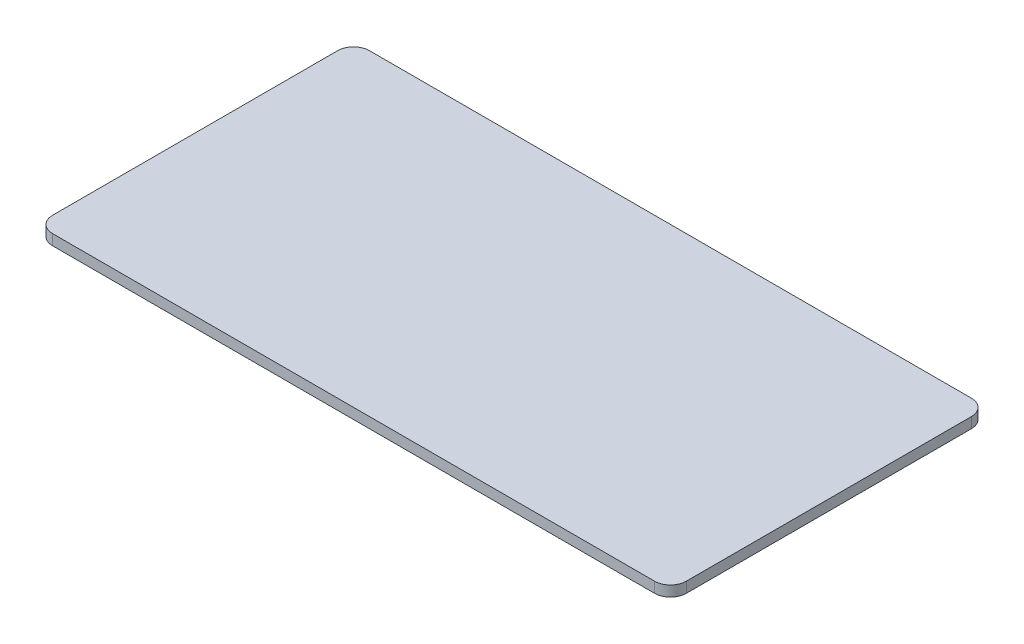
ISO-10303-21;
HEADER;
FILE_DESCRIPTION(('STEP AP214'),'2;1');
FILE_NAME('part.step','',(''),(''),'','','');
FILE_SCHEMA(('AUTOMOTIVE_DESIGN { 1 0 10303 214 1 1 1 1 }'));
ENDSEC;
DATA;
#1=APPLICATION_CONTEXT('core data for automotive mechanical design processes');
#2=APPLICATION_PROTOCOL_DEFINITION('international standard','automotive_design',2000,#1);
#3=PRODUCT_CONTEXT('',#1,'mechanical');
#4=PRODUCT('Part','Part','',(#3));
#5=PRODUCT_RELATED_PRODUCT_CATEGORY('part','',(#4));
#6=PRODUCT_DEFINITION_FORMATION('','',#4);
#7=PRODUCT_DEFINITION_CONTEXT('part definition',#1,'design');
#8=PRODUCT_DEFINITION('design','',#6,#7);
#9=PRODUCT_DEFINITION_SHAPE('','',#8);
#10=(LENGTH_UNIT() NAMED_UNIT(*) SI_UNIT(.MILLI.,.METRE.));
#11=(NAMED_UNIT(*) PLANE_ANGLE_UNIT() SI_UNIT($,.RADIAN.));
#12=(NAMED_UNIT(*) SI_UNIT($,.STERADIAN.) SOLID_ANGLE_UNIT());
#13=UNCERTAINTY_MEASURE_WITH_UNIT(LENGTH_MEASURE(1.E-05),#10,'distance_accuracy_value','');
#14=(GEOMETRIC_REPRESENTATION_CONTEXT(3) GLOBAL_UNCERTAINTY_ASSIGNED_CONTEXT((#13)) GLOBAL_UNIT_ASSIGNED_CONTEXT((#10,
#11,#12)) REPRESENTATION_CONTEXT('',''));
#15=CARTESIAN_POINT('',(0.,0.,0.));
#16=DIRECTION('',(0.,0.,1.));
#17=DIRECTION('',(1.,0.,0.));
#18=AXIS2_PLACEMENT_3D('',#15,#16,#17);
#19=CARTESIAN_POINT('',(-513.972080869749,20.,307.319748063678));
#20=DIRECTION('',(1.,0.,0.));
#21=DIRECTION('',(0.,0.,-1.));
#22=AXIS2_PLACEMENT_3D('',#19,#20,#21);
#23=PLANE('',#22);
#24=DIRECTION('',(0.,0.,1.));
#25=VECTOR('',#24,1.);
#26=CARTESIAN_POINT('',(-513.972080869749,20.,307.319748063678));
#27=LINE('',#26,#25);
#28=CARTESIAN_POINT('',(-513.972080869749,20.,-262.680251936322));
#29=VERTEX_POINT('',#28);
#30=CARTESIAN_POINT('',(-513.972080869749,20.,277.319748063678));
#31=VERTEX_POINT('',#30);
#32=EDGE_CURVE('E117',#29,#31,#27,.T.);
#33=ORIENTED_EDGE('',*,*,#32,.F.);
#34=DIRECTION('',(0.,-1.,0.));
#35=VECTOR('',#34,1.);
#36=CARTESIAN_POINT('',(-513.972080869749,20.,-262.680251936322));
#37=LINE('',#36,#35);
#38=CARTESIAN_POINT('',(-513.972080869749,0.,-262.680251936322));
#39=VERTEX_POINT('',#38);
#40=EDGE_CURVE('E102',#29,#39,#37,.T.);
#41=ORIENTED_EDGE('',*,*,#40,.T.);
#42=DIRECTION('',(0.,0.,1.));
#43=VECTOR('',#42,1.);
#44=CARTESIAN_POINT('',(-513.972080869749,0.,307.319748063678));
#45=LINE('',#44,#43);
#46=CARTESIAN_POINT('',(-513.972080869749,0.,277.319748063678));
#47=VERTEX_POINT('',#46);
#48=EDGE_CURVE('E114',#39,#47,#45,.T.);
#49=ORIENTED_EDGE('',*,*,#48,.T.);
#50=DIRECTION('',(0.,-1.,0.));
#51=VECTOR('',#50,1.);
#52=CARTESIAN_POINT('',(-513.972080869749,20.,277.319748063678));
#53=LINE('',#52,#51);
#54=EDGE_CURVE('E119',#47,#31,#53,.F.);
#55=ORIENTED_EDGE('',*,*,#54,.T.);
#56=EDGE_LOOP('',(#33,#41,#49,#55));
#57=FACE_BOUND('',#56,.T.);
#58=ADVANCED_FACE('F33',(#57),#23,.F.);
#59=CARTESIAN_POINT('',(-513.972080869749,20.,307.319748063678));
#60=DIRECTION('',(0.,0.,-1.));
#61=DIRECTION('',(-1.,0.,0.));
#62=AXIS2_PLACEMENT_3D('',#59,#60,#61);
#63=PLANE('',#62);
#64=DIRECTION('',(1.,0.,0.));
#65=VECTOR('',#64,1.);
#66=CARTESIAN_POINT('',(-513.972080869749,20.,307.319748063678));
#67=LINE('',#66,#65);
#68=CARTESIAN_POINT('',(-483.972080869749,20.,307.319748063678));
#69=VERTEX_POINT('',#68);
#70=CARTESIAN_POINT('',(656.027919130251,20.,307.319748063678));
#71=VERTEX_POINT('',#70);
#72=EDGE_CURVE('E168',#69,#71,#67,.T.);
#73=ORIENTED_EDGE('',*,*,#72,.F.);
#74=DIRECTION('',(0.,-1.,0.));
#75=VECTOR('',#74,1.);
#76=CARTESIAN_POINT('',(-483.972080869749,20.,307.319748063678));
#77=LINE('',#76,#75);
#78=CARTESIAN_POINT('',(-483.972080869749,0.,307.319748063678));
#79=VERTEX_POINT('',#78);
#80=EDGE_CURVE('E152',#69,#79,#77,.T.);
#81=ORIENTED_EDGE('',*,*,#80,.T.);
#82=DIRECTION('',(1.,0.,0.));
#83=VECTOR('',#82,1.);
#84=CARTESIAN_POINT('',(-513.972080869749,0.,307.319748063678));
#85=LINE('',#84,#83);
#86=CARTESIAN_POINT('',(656.027919130251,0.,307.319748063678));
#87=VERTEX_POINT('',#86);
#88=EDGE_CURVE('E123',#79,#87,#85,.T.);
#89=ORIENTED_EDGE('',*,*,#88,.T.);
#90=DIRECTION('',(0.,-1.,0.));
#91=VECTOR('',#90,1.);
#92=CARTESIAN_POINT('',(656.027919130251,20.,307.319748063678));
#93=LINE('',#92,#91);
#94=EDGE_CURVE('E150',#87,#71,#93,.F.);
#95=ORIENTED_EDGE('',*,*,#94,.T.);
#96=EDGE_LOOP('',(#73,#81,#89,#95));
#97=FACE_BOUND('',#96,.T.);
#98=ADVANCED_FACE('F178',(#97),#63,.F.);
#99=CARTESIAN_POINT('',(686.027919130251,20.,307.319748063678));
#100=DIRECTION('',(-1.,0.,0.));
#101=DIRECTION('',(0.,0.,1.));
#102=AXIS2_PLACEMENT_3D('',#99,#100,#101);
#103=PLANE('',#102);
#104=DIRECTION('',(0.,0.,-1.));
#105=VECTOR('',#104,1.);
#106=CARTESIAN_POINT('',(686.027919130251,0.,307.319748063678));
#107=LINE('',#106,#105);
#108=CARTESIAN_POINT('',(686.027919130251,0.,277.319748063678));
#109=VERTEX_POINT('',#108);
#110=CARTESIAN_POINT('',(686.027919130251,0.,-262.680251936322));
#111=VERTEX_POINT('',#110);
#112=EDGE_CURVE('E126',#109,#111,#107,.T.);
#113=ORIENTED_EDGE('',*,*,#112,.T.);
#114=DIRECTION('',(0.,-1.,0.));
#115=VECTOR('',#114,1.);
#116=CARTESIAN_POINT('',(686.027919130251,20.,-262.680251936322));
#117=LINE('',#116,#115);
#118=CARTESIAN_POINT('',(686.027919130251,20.,-262.680251936322));
#119=VERTEX_POINT('',#118);
#120=EDGE_CURVE('E11',#111,#119,#117,.F.);
#121=ORIENTED_EDGE('',*,*,#120,.T.);
#122=DIRECTION('',(0.,0.,-1.));
#123=VECTOR('',#122,1.);
#124=CARTESIAN_POINT('',(686.027919130251,20.,307.319748063678));
#125=LINE('',#124,#123);
#126=CARTESIAN_POINT('',(686.027919130251,20.,277.319748063678));
#127=VERTEX_POINT('',#126);
#128=EDGE_CURVE('E158',#127,#119,#125,.T.);
#129=ORIENTED_EDGE('',*,*,#128,.F.);
#130=DIRECTION('',(0.,-1.,0.));
#131=VECTOR('',#130,1.);
#132=CARTESIAN_POINT('',(686.027919130251,20.,277.319748063678));
#133=LINE('',#132,#131);
#134=EDGE_CURVE('E41',#127,#109,#133,.T.);
#135=ORIENTED_EDGE('',*,*,#134,.T.);
#136=EDGE_LOOP('',(#113,#121,#129,#135));
#137=FACE_BOUND('',#136,.T.);
#138=ADVANCED_FACE('F157',(#137),#103,.F.);
#139=CARTESIAN_POINT('',(-513.972080869749,20.,-292.680251936322));
#140=DIRECTION('',(0.,0.,1.));
#141=DIRECTION('',(1.,0.,0.));
#142=AXIS2_PLACEMENT_3D('',#139,#140,#141);
#143=PLANE('',#142);
#144=DIRECTION('',(-1.,0.,0.));
#145=VECTOR('',#144,1.);
#146=CARTESIAN_POINT('',(-513.972080869749,0.,-292.680251936322));
#147=LINE('',#146,#145);
#148=CARTESIAN_POINT('',(656.027919130251,0.,-292.680251936322));
#149=VERTEX_POINT('',#148);
#150=CARTESIAN_POINT('',(-483.972080869749,0.,-292.680251936322));
#151=VERTEX_POINT('',#150);
#152=EDGE_CURVE('E133',#149,#151,#147,.T.);
#153=ORIENTED_EDGE('',*,*,#152,.T.);
#154=DIRECTION('',(0.,-1.,0.));
#155=VECTOR('',#154,1.);
#156=CARTESIAN_POINT('',(-483.972080869749,20.,-292.680251936322));
#157=LINE('',#156,#155);
#158=CARTESIAN_POINT('',(-483.972080869749,20.,-292.680251936322));
#159=VERTEX_POINT('',#158);
#160=EDGE_CURVE('E103',#151,#159,#157,.F.);
#161=ORIENTED_EDGE('',*,*,#160,.T.);
#162=DIRECTION('',(-1.,0.,0.));
#163=VECTOR('',#162,1.);
#164=CARTESIAN_POINT('',(-513.972080869749,20.,-292.680251936322));
#165=LINE('',#164,#163);
#166=CARTESIAN_POINT('',(656.027919130251,20.,-292.680251936322));
#167=VERTEX_POINT('',#166);
#168=EDGE_CURVE('E129',#167,#159,#165,.T.);
#169=ORIENTED_EDGE('',*,*,#168,.F.);
#170=DIRECTION('',(0.,-1.,0.));
#171=VECTOR('',#170,1.);
#172=CARTESIAN_POINT('',(656.027919130251,20.,-292.680251936322));
#173=LINE('',#172,#171);
#174=EDGE_CURVE('E108',#167,#149,#173,.T.);
#175=ORIENTED_EDGE('',*,*,#174,.T.);
#176=EDGE_LOOP('',(#153,#161,#169,#175));
#177=FACE_BOUND('',#176,.T.);
#178=ADVANCED_FACE('F166',(#177),#143,.F.);
#179=CARTESIAN_POINT('',(0.,20.,0.));
#180=DIRECTION('',(0.,-1.,0.));
#181=DIRECTION('',(0.,0.,-1.));
#182=AXIS2_PLACEMENT_3D('',#179,#180,#181);
#183=PLANE('',#182);
#184=ORIENTED_EDGE('',*,*,#168,.T.);
#185=CARTESIAN_POINT('',(-483.972080869749,20.,-262.680251936322));
#186=DIRECTION('',(0.,-1.,0.));
#187=DIRECTION('',(0.,0.,-1.));
#188=AXIS2_PLACEMENT_3D('',#185,#186,#187);
#189=CIRCLE('',#188,30.);
#190=EDGE_CURVE('E148',#159,#29,#189,.F.);
#191=ORIENTED_EDGE('',*,*,#190,.T.);
#192=ORIENTED_EDGE('',*,*,#32,.T.);
#193=CARTESIAN_POINT('',(-483.972080869749,20.,277.319748063678));
#194=DIRECTION('',(0.,-1.,0.));
#195=DIRECTION('',(0.,0.,-1.));
#196=AXIS2_PLACEMENT_3D('',#193,#194,#195);
#197=CIRCLE('',#196,30.);
#198=EDGE_CURVE('E146',#31,#69,#197,.F.);
#199=ORIENTED_EDGE('',*,*,#198,.T.);
#200=ORIENTED_EDGE('',*,*,#72,.T.);
#201=CARTESIAN_POINT('',(656.027919130251,20.,277.319748063678));
#202=DIRECTION('',(0.,-1.,0.));
#203=DIRECTION('',(0.,0.,-1.));
#204=AXIS2_PLACEMENT_3D('',#201,#202,#203);
#205=CIRCLE('',#204,30.);
#206=EDGE_CURVE('E53',#71,#127,#205,.F.);
#207=ORIENTED_EDGE('',*,*,#206,.T.);
#208=ORIENTED_EDGE('',*,*,#128,.T.);
#209=CARTESIAN_POINT('',(656.027919130251,20.,-262.680251936322));
#210=DIRECTION('',(0.,-1.,0.));
#211=DIRECTION('',(0.,0.,-1.));
#212=AXIS2_PLACEMENT_3D('',#209,#210,#211);
#213=CIRCLE('',#212,30.);
#214=EDGE_CURVE('E144',#119,#167,#213,.F.);
#215=ORIENTED_EDGE('',*,*,#214,.T.);
#216=EDGE_LOOP('',(#184,#191,#192,#199,#200,#207,#208,#215));
#217=FACE_BOUND('',#216,.T.);
#218=ADVANCED_FACE('F172',(#217),#183,.F.);
#219=CARTESIAN_POINT('',(0.,0.,0.));
#220=DIRECTION('',(0.,-1.,0.));
#221=DIRECTION('',(0.,0.,-1.));
#222=AXIS2_PLACEMENT_3D('',#219,#220,#221);
#223=PLANE('',#222);
#224=ORIENTED_EDGE('',*,*,#48,.F.);
#225=CARTESIAN_POINT('',(-483.972080869749,0.,-262.680251936322));
#226=DIRECTION('',(0.,-1.,0.));
#227=DIRECTION('',(0.,0.,-1.));
#228=AXIS2_PLACEMENT_3D('',#225,#226,#227);
#229=CIRCLE('',#228,30.);
#230=EDGE_CURVE('E98',#39,#151,#229,.T.);
#231=ORIENTED_EDGE('',*,*,#230,.T.);
#232=ORIENTED_EDGE('',*,*,#152,.F.);
#233=CARTESIAN_POINT('',(656.027919130251,0.,-262.680251936322));
#234=DIRECTION('',(0.,-1.,0.));
#235=DIRECTION('',(0.,0.,-1.));
#236=AXIS2_PLACEMENT_3D('',#233,#234,#235);
#237=CIRCLE('',#236,30.);
#238=EDGE_CURVE('E137',#149,#111,#237,.T.);
#239=ORIENTED_EDGE('',*,*,#238,.T.);
#240=ORIENTED_EDGE('',*,*,#112,.F.);
#241=CARTESIAN_POINT('',(656.027919130251,0.,277.319748063678));
#242=DIRECTION('',(0.,-1.,0.));
#243=DIRECTION('',(0.,0.,-1.));
#244=AXIS2_PLACEMENT_3D('',#241,#242,#243);
#245=CIRCLE('',#244,30.);
#246=EDGE_CURVE('E118',#109,#87,#245,.T.);
#247=ORIENTED_EDGE('',*,*,#246,.T.);
#248=ORIENTED_EDGE('',*,*,#88,.F.);
#249=CARTESIAN_POINT('',(-483.972080869749,0.,277.319748063678));
#250=DIRECTION('',(0.,-1.,0.));
#251=DIRECTION('',(0.,0.,-1.));
#252=AXIS2_PLACEMENT_3D('',#249,#250,#251);
#253=CIRCLE('',#252,30.);
#254=EDGE_CURVE('E109',#79,#47,#253,.T.);
#255=ORIENTED_EDGE('',*,*,#254,.T.);
#256=EDGE_LOOP('',(#224,#231,#232,#239,#240,#247,#248,#255));
#257=FACE_BOUND('',#256,.T.);
#258=ADVANCED_FACE('F121',(#257),#223,.T.);
#259=CARTESIAN_POINT('',(-483.972080869749,20.,-262.680251936322));
#260=DIRECTION('',(0.,-1.,0.));
#261=DIRECTION('',(0.,0.,-1.));
#262=AXIS2_PLACEMENT_3D('',#259,#260,#261);
#263=CYLINDRICAL_SURFACE('',#262,30.);
#264=ORIENTED_EDGE('',*,*,#190,.F.);
#265=ORIENTED_EDGE('',*,*,#160,.F.);
#266=ORIENTED_EDGE('',*,*,#230,.F.);
#267=ORIENTED_EDGE('',*,*,#40,.F.);
#268=EDGE_LOOP('',(#264,#265,#266,#267));
#269=FACE_BOUND('',#268,.T.);
#270=ADVANCED_FACE('F101',(#269),#263,.T.);
#271=CARTESIAN_POINT('',(-483.972080869749,20.,277.319748063678));
#272=DIRECTION('',(0.,-1.,0.));
#273=DIRECTION('',(0.,0.,-1.));
#274=AXIS2_PLACEMENT_3D('',#271,#272,#273);
#275=CYLINDRICAL_SURFACE('',#274,30.);
#276=ORIENTED_EDGE('',*,*,#198,.F.);
#277=ORIENTED_EDGE('',*,*,#54,.F.);
#278=ORIENTED_EDGE('',*,*,#254,.F.);
#279=ORIENTED_EDGE('',*,*,#80,.F.);
#280=EDGE_LOOP('',(#276,#277,#278,#279));
#281=FACE_BOUND('',#280,.T.);
#282=ADVANCED_FACE('F176',(#281),#275,.T.);
#283=CARTESIAN_POINT('',(656.027919130251,20.,-262.680251936322));
#284=DIRECTION('',(0.,-1.,0.));
#285=DIRECTION('',(0.,0.,-1.));
#286=AXIS2_PLACEMENT_3D('',#283,#284,#285);
#287=CYLINDRICAL_SURFACE('',#286,30.);
#288=ORIENTED_EDGE('',*,*,#214,.F.);
#289=ORIENTED_EDGE('',*,*,#120,.F.);
#290=ORIENTED_EDGE('',*,*,#238,.F.);
#291=ORIENTED_EDGE('',*,*,#174,.F.);
#292=EDGE_LOOP('',(#288,#289,#290,#291));
#293=FACE_BOUND('',#292,.T.);
#294=ADVANCED_FACE('F163',(#293),#287,.T.);
#295=CARTESIAN_POINT('',(656.027919130251,20.,277.319748063678));
#296=DIRECTION('',(0.,-1.,0.));
#297=DIRECTION('',(0.,0.,-1.));
#298=AXIS2_PLACEMENT_3D('',#295,#296,#297);
#299=CYLINDRICAL_SURFACE('',#298,30.);
#300=ORIENTED_EDGE('',*,*,#206,.F.);
#301=ORIENTED_EDGE('',*,*,#94,.F.);
#302=ORIENTED_EDGE('',*,*,#246,.F.);
#303=ORIENTED_EDGE('',*,*,#134,.F.);
#304=EDGE_LOOP('',(#300,#301,#302,#303));
#305=FACE_BOUND('',#304,.T.);
#306=ADVANCED_FACE('F35',(#305),#299,.T.);
#307=CLOSED_SHELL('',(#58,#98,#138,#178,#218,#258,#270,#282,#294,#306));
#308=MANIFOLD_SOLID_BREP('B2',#307);
#309=ADVANCED_BREP_SHAPE_REPRESENTATION('',(#18,#308),#14);
#310=SHAPE_DEFINITION_REPRESENTATION(#9,#309);
ENDSEC;
END-ISO-10303-21;
